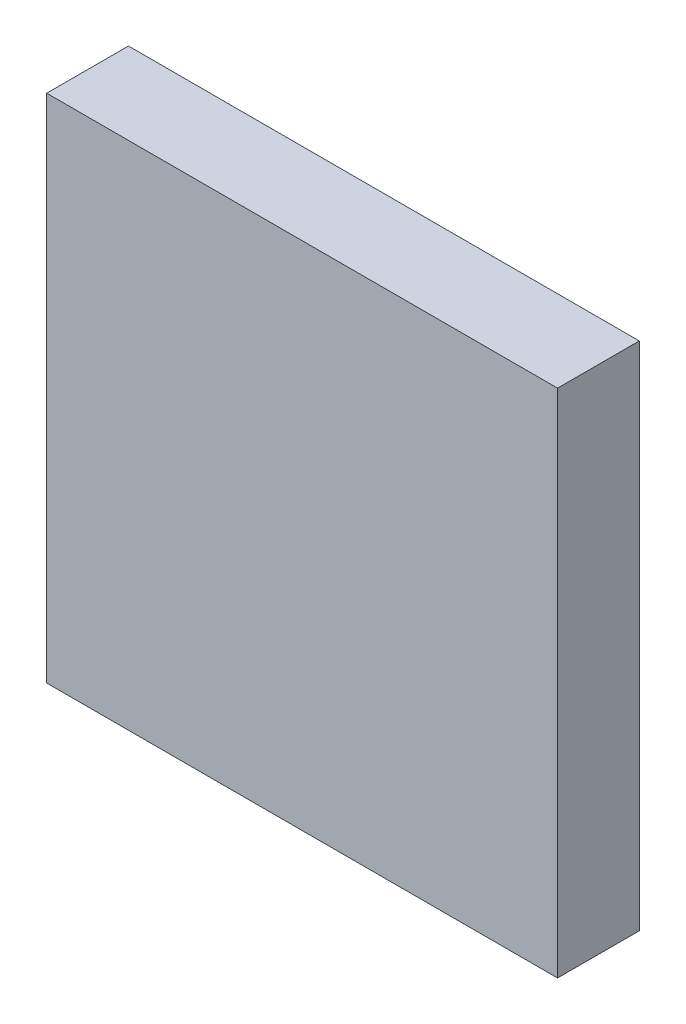
ISO-10303-21;
HEADER;
FILE_DESCRIPTION(('STEP AP214'),'2;1');
FILE_NAME('part.step','',(''),(''),'','','');
FILE_SCHEMA(('AUTOMOTIVE_DESIGN { 1 0 10303 214 1 1 1 1 }'));
ENDSEC;
DATA;
#1=APPLICATION_CONTEXT('core data for automotive mechanical design processes');
#2=APPLICATION_PROTOCOL_DEFINITION('international standard','automotive_design',2000,#1);
#3=PRODUCT_CONTEXT('',#1,'mechanical');
#4=PRODUCT('Part','Part','',(#3));
#5=PRODUCT_RELATED_PRODUCT_CATEGORY('part','',(#4));
#6=PRODUCT_DEFINITION_FORMATION('','',#4);
#7=PRODUCT_DEFINITION_CONTEXT('part definition',#1,'design');
#8=PRODUCT_DEFINITION('design','',#6,#7);
#9=PRODUCT_DEFINITION_SHAPE('','',#8);
#10=(LENGTH_UNIT() NAMED_UNIT(*) SI_UNIT(.MILLI.,.METRE.));
#11=(NAMED_UNIT(*) PLANE_ANGLE_UNIT() SI_UNIT($,.RADIAN.));
#12=(NAMED_UNIT(*) SI_UNIT($,.STERADIAN.) SOLID_ANGLE_UNIT());
#13=UNCERTAINTY_MEASURE_WITH_UNIT(LENGTH_MEASURE(1.E-05),#10,'distance_accuracy_value','');
#14=(GEOMETRIC_REPRESENTATION_CONTEXT(3) GLOBAL_UNCERTAINTY_ASSIGNED_CONTEXT((#13)) GLOBAL_UNIT_ASSIGNED_CONTEXT((#10,
#11,#12)) REPRESENTATION_CONTEXT('',''));
#15=CARTESIAN_POINT('',(0.,0.,0.));
#16=DIRECTION('',(0.,0.,1.));
#17=DIRECTION('',(1.,0.,0.));
#18=AXIS2_PLACEMENT_3D('',#15,#16,#17);
#19=CARTESIAN_POINT('',(0.,0.,4.));
#20=DIRECTION('',(1.,0.,0.));
#21=DIRECTION('',(0.,0.,-1.));
#22=AXIS2_PLACEMENT_3D('',#19,#20,#21);
#23=PLANE('',#22);
#24=DIRECTION('',(0.,-1.,0.));
#25=VECTOR('',#24,1.);
#26=CARTESIAN_POINT('',(0.,0.,0.));
#27=LINE('',#26,#25);
#28=CARTESIAN_POINT('',(0.,25.,0.));
#29=VERTEX_POINT('',#28);
#30=CARTESIAN_POINT('',(0.,0.,0.));
#31=VERTEX_POINT('',#30);
#32=EDGE_CURVE('E97',#29,#31,#27,.T.);
#33=ORIENTED_EDGE('',*,*,#32,.T.);
#34=DIRECTION('',(0.,0.,-1.));
#35=VECTOR('',#34,1.);
#36=CARTESIAN_POINT('',(0.,0.,4.));
#37=LINE('',#36,#35);
#38=CARTESIAN_POINT('',(0.,0.,4.));
#39=VERTEX_POINT('',#38);
#40=EDGE_CURVE('E11',#39,#31,#37,.T.);
#41=ORIENTED_EDGE('',*,*,#40,.F.);
#42=DIRECTION('',(0.,-1.,0.));
#43=VECTOR('',#42,1.);
#44=CARTESIAN_POINT('',(0.,0.,4.));
#45=LINE('',#44,#43);
#46=CARTESIAN_POINT('',(0.,25.,4.));
#47=VERTEX_POINT('',#46);
#48=EDGE_CURVE('E85',#47,#39,#45,.T.);
#49=ORIENTED_EDGE('',*,*,#48,.F.);
#50=DIRECTION('',(0.,0.,-1.));
#51=VECTOR('',#50,1.);
#52=CARTESIAN_POINT('',(0.,25.,4.));
#53=LINE('',#52,#51);
#54=EDGE_CURVE('E93',#47,#29,#53,.T.);
#55=ORIENTED_EDGE('',*,*,#54,.T.);
#56=EDGE_LOOP('',(#33,#41,#49,#55));
#57=FACE_BOUND('',#56,.T.);
#58=ADVANCED_FACE('F34',(#57),#23,.F.);
#59=CARTESIAN_POINT('',(0.,0.,4.));
#60=DIRECTION('',(0.,1.,0.));
#61=DIRECTION('',(0.,0.,1.));
#62=AXIS2_PLACEMENT_3D('',#59,#60,#61);
#63=PLANE('',#62);
#64=DIRECTION('',(1.,0.,0.));
#65=VECTOR('',#64,1.);
#66=CARTESIAN_POINT('',(0.,0.,0.));
#67=LINE('',#66,#65);
#68=CARTESIAN_POINT('',(25.,0.,0.));
#69=VERTEX_POINT('',#68);
#70=EDGE_CURVE('E89',#31,#69,#67,.T.);
#71=ORIENTED_EDGE('',*,*,#70,.T.);
#72=DIRECTION('',(0.,0.,-1.));
#73=VECTOR('',#72,1.);
#74=CARTESIAN_POINT('',(25.,0.,4.));
#75=LINE('',#74,#73);
#76=CARTESIAN_POINT('',(25.,0.,4.));
#77=VERTEX_POINT('',#76);
#78=EDGE_CURVE('E42',#77,#69,#75,.T.);
#79=ORIENTED_EDGE('',*,*,#78,.F.);
#80=DIRECTION('',(1.,0.,0.));
#81=VECTOR('',#80,1.);
#82=CARTESIAN_POINT('',(0.,0.,4.));
#83=LINE('',#82,#81);
#84=EDGE_CURVE('E80',#39,#77,#83,.T.);
#85=ORIENTED_EDGE('',*,*,#84,.F.);
#86=ORIENTED_EDGE('',*,*,#40,.T.);
#87=EDGE_LOOP('',(#71,#79,#85,#86));
#88=FACE_BOUND('',#87,.T.);
#89=ADVANCED_FACE('F88',(#88),#63,.F.);
#90=CARTESIAN_POINT('',(25.,0.,4.));
#91=DIRECTION('',(-1.,0.,0.));
#92=DIRECTION('',(0.,0.,1.));
#93=AXIS2_PLACEMENT_3D('',#90,#91,#92);
#94=PLANE('',#93);
#95=DIRECTION('',(0.,1.,0.));
#96=VECTOR('',#95,1.);
#97=CARTESIAN_POINT('',(25.,0.,0.));
#98=LINE('',#97,#96);
#99=CARTESIAN_POINT('',(25.,25.,0.));
#100=VERTEX_POINT('',#99);
#101=EDGE_CURVE('E67',#69,#100,#98,.T.);
#102=ORIENTED_EDGE('',*,*,#101,.T.);
#103=DIRECTION('',(0.,0.,-1.));
#104=VECTOR('',#103,1.);
#105=CARTESIAN_POINT('',(25.,25.,4.));
#106=LINE('',#105,#104);
#107=CARTESIAN_POINT('',(25.,25.,4.));
#108=VERTEX_POINT('',#107);
#109=EDGE_CURVE('E90',#108,#100,#106,.T.);
#110=ORIENTED_EDGE('',*,*,#109,.F.);
#111=DIRECTION('',(0.,1.,0.));
#112=VECTOR('',#111,1.);
#113=CARTESIAN_POINT('',(25.,0.,4.));
#114=LINE('',#113,#112);
#115=EDGE_CURVE('E83',#77,#108,#114,.T.);
#116=ORIENTED_EDGE('',*,*,#115,.F.);
#117=ORIENTED_EDGE('',*,*,#78,.T.);
#118=EDGE_LOOP('',(#102,#110,#116,#117));
#119=FACE_BOUND('',#118,.T.);
#120=ADVANCED_FACE('F91',(#119),#94,.F.);
#121=CARTESIAN_POINT('',(0.,25.,4.));
#122=DIRECTION('',(0.,-1.,0.));
#123=DIRECTION('',(0.,0.,-1.));
#124=AXIS2_PLACEMENT_3D('',#121,#122,#123);
#125=PLANE('',#124);
#126=DIRECTION('',(-1.,0.,0.));
#127=VECTOR('',#126,1.);
#128=CARTESIAN_POINT('',(0.,25.,0.));
#129=LINE('',#128,#127);
#130=EDGE_CURVE('E73',#100,#29,#129,.T.);
#131=ORIENTED_EDGE('',*,*,#130,.T.);
#132=ORIENTED_EDGE('',*,*,#54,.F.);
#133=DIRECTION('',(-1.,0.,0.));
#134=VECTOR('',#133,1.);
#135=CARTESIAN_POINT('',(0.,25.,4.));
#136=LINE('',#135,#134);
#137=EDGE_CURVE('E50',#108,#47,#136,.T.);
#138=ORIENTED_EDGE('',*,*,#137,.F.);
#139=ORIENTED_EDGE('',*,*,#109,.T.);
#140=EDGE_LOOP('',(#131,#132,#138,#139));
#141=FACE_BOUND('',#140,.T.);
#142=ADVANCED_FACE('F104',(#141),#125,.F.);
#143=CARTESIAN_POINT('',(0.,0.,4.));
#144=DIRECTION('',(0.,0.,-1.));
#145=DIRECTION('',(-1.,0.,0.));
#146=AXIS2_PLACEMENT_3D('',#143,#144,#145);
#147=PLANE('',#146);
#148=ORIENTED_EDGE('',*,*,#48,.T.);
#149=ORIENTED_EDGE('',*,*,#84,.T.);
#150=ORIENTED_EDGE('',*,*,#115,.T.);
#151=ORIENTED_EDGE('',*,*,#137,.T.);
#152=EDGE_LOOP('',(#148,#149,#150,#151));
#153=FACE_BOUND('',#152,.T.);
#154=ADVANCED_FACE('F81',(#153),#147,.F.);
#155=CARTESIAN_POINT('',(0.,0.,0.));
#156=DIRECTION('',(0.,0.,-1.));
#157=DIRECTION('',(-1.,0.,0.));
#158=AXIS2_PLACEMENT_3D('',#155,#156,#157);
#159=PLANE('',#158);
#160=ORIENTED_EDGE('',*,*,#32,.F.);
#161=ORIENTED_EDGE('',*,*,#130,.F.);
#162=ORIENTED_EDGE('',*,*,#101,.F.);
#163=ORIENTED_EDGE('',*,*,#70,.F.);
#164=EDGE_LOOP('',(#160,#161,#162,#163));
#165=FACE_BOUND('',#164,.T.);
#166=ADVANCED_FACE('F107',(#165),#159,.T.);
#167=CLOSED_SHELL('',(#58,#89,#120,#142,#154,#166));
#168=MANIFOLD_SOLID_BREP('B2',#167);
#169=ADVANCED_BREP_SHAPE_REPRESENTATION('',(#18,#168),#14);
#170=SHAPE_DEFINITION_REPRESENTATION(#9,#169);
ENDSEC;
END-ISO-10303-21;
